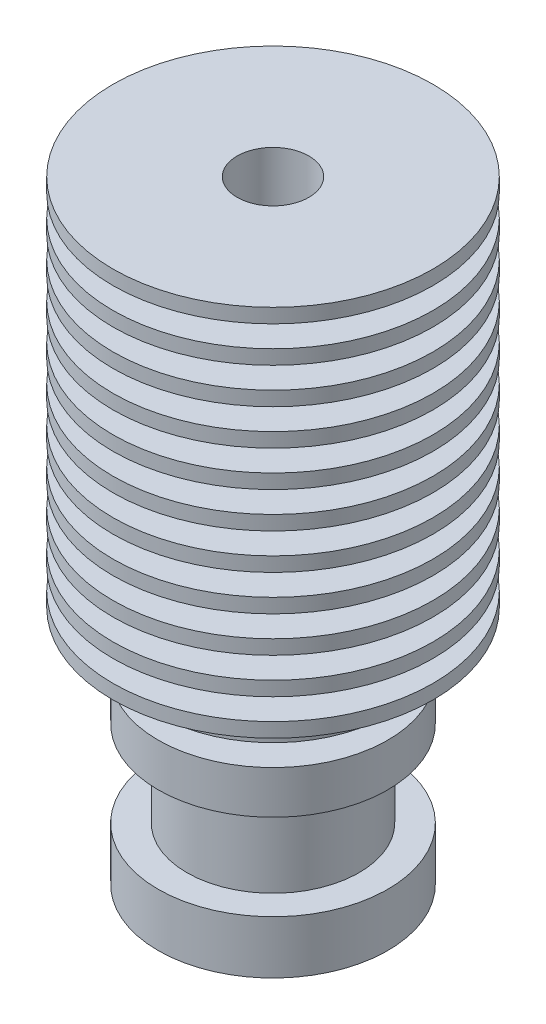
ISO-10303-21;
HEADER;
FILE_DESCRIPTION(('STEP AP214'),'2;1');
FILE_NAME('part.step','',(''),(''),'','','');
FILE_SCHEMA(('AUTOMOTIVE_DESIGN { 1 0 10303 214 1 1 1 1 }'));
ENDSEC;
DATA;
#1=APPLICATION_CONTEXT('core data for automotive mechanical design processes');
#2=APPLICATION_PROTOCOL_DEFINITION('international standard','automotive_design',2000,#1);
#3=PRODUCT_CONTEXT('',#1,'mechanical');
#4=PRODUCT('Part','Part','',(#3));
#5=PRODUCT_RELATED_PRODUCT_CATEGORY('part','',(#4));
#6=PRODUCT_DEFINITION_FORMATION('','',#4);
#7=PRODUCT_DEFINITION_CONTEXT('part definition',#1,'design');
#8=PRODUCT_DEFINITION('design','',#6,#7);
#9=PRODUCT_DEFINITION_SHAPE('','',#8);
#10=(LENGTH_UNIT() NAMED_UNIT(*) SI_UNIT(.MILLI.,.METRE.));
#11=(NAMED_UNIT(*) PLANE_ANGLE_UNIT() SI_UNIT($,.RADIAN.));
#12=(NAMED_UNIT(*) SI_UNIT($,.STERADIAN.) SOLID_ANGLE_UNIT());
#13=UNCERTAINTY_MEASURE_WITH_UNIT(LENGTH_MEASURE(1.E-05),#10,'distance_accuracy_value','');
#14=(GEOMETRIC_REPRESENTATION_CONTEXT(3) GLOBAL_UNCERTAINTY_ASSIGNED_CONTEXT((#13)) GLOBAL_UNIT_ASSIGNED_CONTEXT((#10,
#11,#12)) REPRESENTATION_CONTEXT('',''));
#15=CARTESIAN_POINT('',(0.,0.,0.));
#16=DIRECTION('',(0.,0.,1.));
#17=DIRECTION('',(1.,0.,0.));
#18=AXIS2_PLACEMENT_3D('',#15,#16,#17);
#19=CARTESIAN_POINT('',(0.,12.7,0.));
#20=DIRECTION('',(0.,1.,0.));
#21=DIRECTION('',(0.,0.,1.));
#22=AXIS2_PLACEMENT_3D('',#19,#20,#21);
#23=CONICAL_SURFACE('',#22,4.5,0.05235987755983);
#24=CARTESIAN_POINT('',(0.,40.2,0.));
#25=DIRECTION('',(0.,1.,0.));
#26=DIRECTION('',(0.,0.,1.));
#27=AXIS2_PLACEMENT_3D('',#24,#25,#26);
#28=CIRCLE('',#27,5.94121393028364);
#29=CARTESIAN_POINT('',(0.,40.2,5.94121393028364));
#30=VERTEX_POINT('',#29);
#31=EDGE_CURVE('E49',#30,#30,#28,.T.);
#32=ORIENTED_EDGE('',*,*,#31,.T.);
#33=EDGE_LOOP('',(#32));
#34=FACE_BOUND('',#33,.T.);
#35=CARTESIAN_POINT('',(0.,41.7,0.));
#36=DIRECTION('',(0.,1.,0.));
#37=DIRECTION('',(0.,0.,1.));
#38=AXIS2_PLACEMENT_3D('',#35,#36,#37);
#39=CIRCLE('',#38,6.0198255992082);
#40=CARTESIAN_POINT('',(0.,41.7,6.0198255992082));
#41=VERTEX_POINT('',#40);
#42=EDGE_CURVE('E10',#41,#41,#39,.T.);
#43=ORIENTED_EDGE('',*,*,#42,.F.);
#44=EDGE_LOOP('',(#43));
#45=FACE_BOUND('',#44,.T.);
#46=ADVANCED_FACE('F34',(#34,#45),#23,.T.);
#47=CARTESIAN_POINT('',(0.,37.7,0.));
#48=DIRECTION('',(0.,1.,0.));
#49=DIRECTION('',(0.,0.,1.));
#50=AXIS2_PLACEMENT_3D('',#47,#48,#49);
#51=CIRCLE('',#50,5.81019448207603);
#52=CARTESIAN_POINT('',(0.,37.7,5.81019448207603));
#53=VERTEX_POINT('',#52);
#54=EDGE_CURVE('E54',#53,#53,#51,.T.);
#55=ORIENTED_EDGE('',*,*,#54,.T.);
#56=EDGE_LOOP('',(#55));
#57=FACE_BOUND('',#56,.T.);
#58=CARTESIAN_POINT('',(0.,39.2,0.));
#59=DIRECTION('',(0.,1.,0.));
#60=DIRECTION('',(0.,0.,1.));
#61=AXIS2_PLACEMENT_3D('',#58,#59,#60);
#62=CIRCLE('',#61,5.88880615100059);
#63=CARTESIAN_POINT('',(0.,39.2,5.88880615100059));
#64=VERTEX_POINT('',#63);
#65=EDGE_CURVE('E42',#64,#64,#62,.T.);
#66=ORIENTED_EDGE('',*,*,#65,.F.);
#67=EDGE_LOOP('',(#66));
#68=FACE_BOUND('',#67,.T.);
#69=ADVANCED_FACE('F252',(#57,#68),#23,.T.);
#70=CARTESIAN_POINT('',(0.,35.2,0.));
#71=DIRECTION('',(0.,1.,0.));
#72=DIRECTION('',(0.,0.,1.));
#73=AXIS2_PLACEMENT_3D('',#70,#71,#72);
#74=CIRCLE('',#73,5.67917503386843);
#75=CARTESIAN_POINT('',(0.,35.2,5.67917503386843));
#76=VERTEX_POINT('',#75);
#77=EDGE_CURVE('E62',#76,#76,#74,.T.);
#78=ORIENTED_EDGE('',*,*,#77,.T.);
#79=EDGE_LOOP('',(#78));
#80=FACE_BOUND('',#79,.T.);
#81=CARTESIAN_POINT('',(0.,36.7,0.));
#82=DIRECTION('',(0.,1.,0.));
#83=DIRECTION('',(0.,0.,1.));
#84=AXIS2_PLACEMENT_3D('',#81,#82,#83);
#85=CIRCLE('',#84,5.75778670279299);
#86=CARTESIAN_POINT('',(0.,36.7,5.75778670279299));
#87=VERTEX_POINT('',#86);
#88=EDGE_CURVE('E46',#87,#87,#85,.T.);
#89=ORIENTED_EDGE('',*,*,#88,.F.);
#90=EDGE_LOOP('',(#89));
#91=FACE_BOUND('',#90,.T.);
#92=ADVANCED_FACE('F258',(#80,#91),#23,.T.);
#93=CARTESIAN_POINT('',(0.,32.7,0.));
#94=DIRECTION('',(0.,1.,0.));
#95=DIRECTION('',(0.,0.,1.));
#96=AXIS2_PLACEMENT_3D('',#93,#94,#95);
#97=CIRCLE('',#96,5.54815558566083);
#98=CARTESIAN_POINT('',(0.,32.7,5.54815558566083));
#99=VERTEX_POINT('',#98);
#100=EDGE_CURVE('E70',#99,#99,#97,.T.);
#101=ORIENTED_EDGE('',*,*,#100,.T.);
#102=EDGE_LOOP('',(#101));
#103=FACE_BOUND('',#102,.T.);
#104=CARTESIAN_POINT('',(0.,34.2,0.));
#105=DIRECTION('',(0.,1.,0.));
#106=DIRECTION('',(0.,0.,1.));
#107=AXIS2_PLACEMENT_3D('',#104,#105,#106);
#108=CIRCLE('',#107,5.62676725458539);
#109=CARTESIAN_POINT('',(0.,34.2,5.62676725458539));
#110=VERTEX_POINT('',#109);
#111=EDGE_CURVE('E61',#110,#110,#108,.T.);
#112=ORIENTED_EDGE('',*,*,#111,.F.);
#113=EDGE_LOOP('',(#112));
#114=FACE_BOUND('',#113,.T.);
#115=ADVANCED_FACE('F496',(#103,#114),#23,.T.);
#116=CARTESIAN_POINT('',(0.,30.2,0.));
#117=DIRECTION('',(0.,1.,0.));
#118=DIRECTION('',(0.,0.,1.));
#119=AXIS2_PLACEMENT_3D('',#116,#117,#118);
#120=CIRCLE('',#119,5.41713613745322);
#121=CARTESIAN_POINT('',(0.,30.2,5.41713613745322));
#122=VERTEX_POINT('',#121);
#123=EDGE_CURVE('E78',#122,#122,#120,.T.);
#124=ORIENTED_EDGE('',*,*,#123,.T.);
#125=EDGE_LOOP('',(#124));
#126=FACE_BOUND('',#125,.T.);
#127=CARTESIAN_POINT('',(0.,31.7,0.));
#128=DIRECTION('',(0.,1.,0.));
#129=DIRECTION('',(0.,0.,1.));
#130=AXIS2_PLACEMENT_3D('',#127,#128,#129);
#131=CIRCLE('',#130,5.49574780637779);
#132=CARTESIAN_POINT('',(0.,31.7,5.49574780637779));
#133=VERTEX_POINT('',#132);
#134=EDGE_CURVE('E69',#133,#133,#131,.T.);
#135=ORIENTED_EDGE('',*,*,#134,.F.);
#136=EDGE_LOOP('',(#135));
#137=FACE_BOUND('',#136,.T.);
#138=ADVANCED_FACE('F486',(#126,#137),#23,.T.);
#139=CARTESIAN_POINT('',(0.,27.7,0.));
#140=DIRECTION('',(0.,1.,0.));
#141=DIRECTION('',(0.,0.,1.));
#142=AXIS2_PLACEMENT_3D('',#139,#140,#141);
#143=CIRCLE('',#142,5.28611668924562);
#144=CARTESIAN_POINT('',(0.,27.7,5.28611668924562));
#145=VERTEX_POINT('',#144);
#146=EDGE_CURVE('E86',#145,#145,#143,.T.);
#147=ORIENTED_EDGE('',*,*,#146,.T.);
#148=EDGE_LOOP('',(#147));
#149=FACE_BOUND('',#148,.T.);
#150=CARTESIAN_POINT('',(0.,29.2,0.));
#151=DIRECTION('',(0.,1.,0.));
#152=DIRECTION('',(0.,0.,1.));
#153=AXIS2_PLACEMENT_3D('',#150,#151,#152);
#154=CIRCLE('',#153,5.36472835817018);
#155=CARTESIAN_POINT('',(0.,29.2,5.36472835817018));
#156=VERTEX_POINT('',#155);
#157=EDGE_CURVE('E77',#156,#156,#154,.T.);
#158=ORIENTED_EDGE('',*,*,#157,.F.);
#159=EDGE_LOOP('',(#158));
#160=FACE_BOUND('',#159,.T.);
#161=ADVANCED_FACE('F476',(#149,#160),#23,.T.);
#162=CARTESIAN_POINT('',(0.,25.2,0.));
#163=DIRECTION('',(0.,1.,0.));
#164=DIRECTION('',(0.,0.,1.));
#165=AXIS2_PLACEMENT_3D('',#162,#163,#164);
#166=CIRCLE('',#165,5.15509724103802);
#167=CARTESIAN_POINT('',(0.,25.2,5.15509724103802));
#168=VERTEX_POINT('',#167);
#169=EDGE_CURVE('E94',#168,#168,#166,.T.);
#170=ORIENTED_EDGE('',*,*,#169,.T.);
#171=EDGE_LOOP('',(#170));
#172=FACE_BOUND('',#171,.T.);
#173=CARTESIAN_POINT('',(0.,26.7,0.));
#174=DIRECTION('',(0.,1.,0.));
#175=DIRECTION('',(0.,0.,1.));
#176=AXIS2_PLACEMENT_3D('',#173,#174,#175);
#177=CIRCLE('',#176,5.23370890996258);
#178=CARTESIAN_POINT('',(0.,26.7,5.23370890996258));
#179=VERTEX_POINT('',#178);
#180=EDGE_CURVE('E85',#179,#179,#177,.T.);
#181=ORIENTED_EDGE('',*,*,#180,.F.);
#182=EDGE_LOOP('',(#181));
#183=FACE_BOUND('',#182,.T.);
#184=ADVANCED_FACE('F471',(#172,#183),#23,.T.);
#185=CARTESIAN_POINT('',(0.,22.7,0.));
#186=DIRECTION('',(0.,1.,0.));
#187=DIRECTION('',(0.,0.,1.));
#188=AXIS2_PLACEMENT_3D('',#185,#186,#187);
#189=CIRCLE('',#188,5.02407779283041);
#190=CARTESIAN_POINT('',(0.,22.7,5.02407779283041));
#191=VERTEX_POINT('',#190);
#192=EDGE_CURVE('E102',#191,#191,#189,.T.);
#193=ORIENTED_EDGE('',*,*,#192,.T.);
#194=EDGE_LOOP('',(#193));
#195=FACE_BOUND('',#194,.T.);
#196=CARTESIAN_POINT('',(0.,24.2,0.));
#197=DIRECTION('',(0.,1.,0.));
#198=DIRECTION('',(0.,0.,1.));
#199=AXIS2_PLACEMENT_3D('',#196,#197,#198);
#200=CIRCLE('',#199,5.10268946175498);
#201=CARTESIAN_POINT('',(0.,24.2,5.10268946175498));
#202=VERTEX_POINT('',#201);
#203=EDGE_CURVE('E93',#202,#202,#200,.T.);
#204=ORIENTED_EDGE('',*,*,#203,.F.);
#205=EDGE_LOOP('',(#204));
#206=FACE_BOUND('',#205,.T.);
#207=ADVANCED_FACE('F465',(#195,#206),#23,.T.);
#208=CARTESIAN_POINT('',(0.,20.2,0.));
#209=DIRECTION('',(0.,1.,0.));
#210=DIRECTION('',(0.,0.,1.));
#211=AXIS2_PLACEMENT_3D('',#208,#209,#210);
#212=CIRCLE('',#211,4.89305834462281);
#213=CARTESIAN_POINT('',(0.,20.2,4.89305834462281));
#214=VERTEX_POINT('',#213);
#215=EDGE_CURVE('E110',#214,#214,#212,.T.);
#216=ORIENTED_EDGE('',*,*,#215,.T.);
#217=EDGE_LOOP('',(#216));
#218=FACE_BOUND('',#217,.T.);
#219=CARTESIAN_POINT('',(0.,21.7,0.));
#220=DIRECTION('',(0.,1.,0.));
#221=DIRECTION('',(0.,0.,1.));
#222=AXIS2_PLACEMENT_3D('',#219,#220,#221);
#223=CIRCLE('',#222,4.97167001354737);
#224=CARTESIAN_POINT('',(0.,21.7,4.97167001354737));
#225=VERTEX_POINT('',#224);
#226=EDGE_CURVE('E101',#225,#225,#223,.T.);
#227=ORIENTED_EDGE('',*,*,#226,.F.);
#228=EDGE_LOOP('',(#227));
#229=FACE_BOUND('',#228,.T.);
#230=ADVANCED_FACE('F287',(#218,#229),#23,.T.);
#231=CARTESIAN_POINT('',(0.,17.7,0.));
#232=DIRECTION('',(0.,1.,0.));
#233=DIRECTION('',(0.,0.,1.));
#234=AXIS2_PLACEMENT_3D('',#231,#232,#233);
#235=CIRCLE('',#234,4.76203889641521);
#236=CARTESIAN_POINT('',(0.,17.7,4.76203889641521));
#237=VERTEX_POINT('',#236);
#238=EDGE_CURVE('E118',#237,#237,#235,.T.);
#239=ORIENTED_EDGE('',*,*,#238,.T.);
#240=EDGE_LOOP('',(#239));
#241=FACE_BOUND('',#240,.T.);
#242=CARTESIAN_POINT('',(0.,19.2,0.));
#243=DIRECTION('',(0.,1.,0.));
#244=DIRECTION('',(0.,0.,1.));
#245=AXIS2_PLACEMENT_3D('',#242,#243,#244);
#246=CIRCLE('',#245,4.84065056533977);
#247=CARTESIAN_POINT('',(0.,19.2,4.84065056533977));
#248=VERTEX_POINT('',#247);
#249=EDGE_CURVE('E109',#248,#248,#246,.T.);
#250=ORIENTED_EDGE('',*,*,#249,.F.);
#251=EDGE_LOOP('',(#250));
#252=FACE_BOUND('',#251,.T.);
#253=ADVANCED_FACE('F278',(#241,#252),#23,.T.);
#254=CARTESIAN_POINT('',(0.,15.2,0.));
#255=DIRECTION('',(0.,1.,0.));
#256=DIRECTION('',(0.,0.,1.));
#257=AXIS2_PLACEMENT_3D('',#254,#255,#256);
#258=CIRCLE('',#257,4.6310194482076);
#259=CARTESIAN_POINT('',(0.,15.2,4.6310194482076));
#260=VERTEX_POINT('',#259);
#261=EDGE_CURVE('E126',#260,#260,#258,.T.);
#262=ORIENTED_EDGE('',*,*,#261,.T.);
#263=EDGE_LOOP('',(#262));
#264=FACE_BOUND('',#263,.T.);
#265=CARTESIAN_POINT('',(0.,16.7,0.));
#266=DIRECTION('',(0.,1.,0.));
#267=DIRECTION('',(0.,0.,1.));
#268=AXIS2_PLACEMENT_3D('',#265,#266,#267);
#269=CIRCLE('',#268,4.70963111713217);
#270=CARTESIAN_POINT('',(0.,16.7,4.70963111713217));
#271=VERTEX_POINT('',#270);
#272=EDGE_CURVE('E117',#271,#271,#269,.T.);
#273=ORIENTED_EDGE('',*,*,#272,.F.);
#274=EDGE_LOOP('',(#273));
#275=FACE_BOUND('',#274,.T.);
#276=ADVANCED_FACE('F265',(#264,#275),#23,.T.);
#277=CARTESIAN_POINT('',(0.,15.2,0.));
#278=DIRECTION('',(0.,1.,0.));
#279=DIRECTION('',(0.,0.,1.));
#280=AXIS2_PLACEMENT_3D('',#277,#278,#279);
#281=PLANE('',#280);
#282=CARTESIAN_POINT('',(0.,15.2,0.));
#283=DIRECTION('',(0.,1.,0.));
#284=DIRECTION('',(0.,0.,1.));
#285=AXIS2_PLACEMENT_3D('',#282,#283,#284);
#286=CIRCLE('',#285,8.);
#287=CARTESIAN_POINT('',(0.,15.2,8.));
#288=VERTEX_POINT('',#287);
#289=EDGE_CURVE('E130',#288,#288,#286,.T.);
#290=ORIENTED_EDGE('',*,*,#289,.T.);
#291=EDGE_LOOP('',(#290));
#292=FACE_BOUND('',#291,.T.);
#293=ORIENTED_EDGE('',*,*,#261,.F.);
#294=EDGE_LOOP('',(#293));
#295=FACE_BOUND('',#294,.T.);
#296=ADVANCED_FACE('F277',(#292,#295),#281,.T.);
#297=CARTESIAN_POINT('',(0.,14.2,0.));
#298=DIRECTION('',(0.,1.,0.));
#299=DIRECTION('',(0.,0.,1.));
#300=AXIS2_PLACEMENT_3D('',#297,#298,#299);
#301=PLANE('',#300);
#302=CARTESIAN_POINT('',(0.,14.2,0.));
#303=DIRECTION('',(0.,1.,0.));
#304=DIRECTION('',(0.,0.,1.));
#305=AXIS2_PLACEMENT_3D('',#302,#303,#304);
#306=CIRCLE('',#305,8.);
#307=CARTESIAN_POINT('',(0.,14.2,8.));
#308=VERTEX_POINT('',#307);
#309=EDGE_CURVE('E121',#308,#308,#306,.T.);
#310=ORIENTED_EDGE('',*,*,#309,.F.);
#311=EDGE_LOOP('',(#310));
#312=FACE_BOUND('',#311,.T.);
#313=CARTESIAN_POINT('',(0.,14.2,0.));
#314=DIRECTION('',(0.,1.,0.));
#315=DIRECTION('',(0.,0.,1.));
#316=AXIS2_PLACEMENT_3D('',#313,#314,#315);
#317=CIRCLE('',#316,4.57861166892456);
#318=CARTESIAN_POINT('',(0.,14.2,4.57861166892456));
#319=VERTEX_POINT('',#318);
#320=EDGE_CURVE('E125',#319,#319,#317,.T.);
#321=ORIENTED_EDGE('',*,*,#320,.T.);
#322=EDGE_LOOP('',(#321));
#323=FACE_BOUND('',#322,.T.);
#324=ADVANCED_FACE('F284',(#312,#323),#301,.F.);
#325=CARTESIAN_POINT('',(0.,15.2,0.));
#326=DIRECTION('',(0.,-1.,0.));
#327=DIRECTION('',(0.,0.,-1.));
#328=AXIS2_PLACEMENT_3D('',#325,#326,#327);
#329=CYLINDRICAL_SURFACE('',#328,8.);
#330=ORIENTED_EDGE('',*,*,#289,.F.);
#331=EDGE_LOOP('',(#330));
#332=FACE_BOUND('',#331,.T.);
#333=ORIENTED_EDGE('',*,*,#309,.T.);
#334=EDGE_LOOP('',(#333));
#335=FACE_BOUND('',#334,.T.);
#336=ADVANCED_FACE('F308',(#332,#335),#329,.T.);
#337=CARTESIAN_POINT('',(0.,0.,0.));
#338=DIRECTION('',(0.,1.,0.));
#339=DIRECTION('',(0.,0.,1.));
#340=AXIS2_PLACEMENT_3D('',#337,#338,#339);
#341=PLANE('',#340);
#342=CARTESIAN_POINT('',(0.,0.,0.));
#343=DIRECTION('',(0.,-1.,0.));
#344=DIRECTION('',(0.,0.,-1.));
#345=AXIS2_PLACEMENT_3D('',#342,#343,#344);
#346=CIRCLE('',#345,2.1);
#347=CARTESIAN_POINT('',(0.,0.,-2.1));
#348=VERTEX_POINT('',#347);
#349=EDGE_CURVE('E222',#348,#348,#346,.T.);
#350=ORIENTED_EDGE('',*,*,#349,.F.);
#351=EDGE_LOOP('',(#350));
#352=FACE_BOUND('',#351,.T.);
#353=CARTESIAN_POINT('',(0.,0.,0.));
#354=DIRECTION('',(0.,1.,0.));
#355=DIRECTION('',(0.,0.,1.));
#356=AXIS2_PLACEMENT_3D('',#353,#354,#355);
#357=CIRCLE('',#356,8.);
#358=CARTESIAN_POINT('',(0.,0.,8.));
#359=VERTEX_POINT('',#358);
#360=EDGE_CURVE('E142',#359,#359,#357,.T.);
#361=ORIENTED_EDGE('',*,*,#360,.F.);
#362=EDGE_LOOP('',(#361));
#363=FACE_BOUND('',#362,.T.);
#364=ADVANCED_FACE('F312',(#352,#363),#341,.F.);
#365=CARTESIAN_POINT('',(0.,3.7,0.));
#366=DIRECTION('',(0.,-1.,0.));
#367=DIRECTION('',(0.,0.,-1.));
#368=AXIS2_PLACEMENT_3D('',#365,#366,#367);
#369=CYLINDRICAL_SURFACE('',#368,8.);
#370=CARTESIAN_POINT('',(0.,3.7,0.));
#371=DIRECTION('',(0.,1.,0.));
#372=DIRECTION('',(0.,0.,1.));
#373=AXIS2_PLACEMENT_3D('',#370,#371,#372);
#374=CIRCLE('',#373,8.);
#375=CARTESIAN_POINT('',(0.,3.7,8.));
#376=VERTEX_POINT('',#375);
#377=EDGE_CURVE('E141',#376,#376,#374,.T.);
#378=ORIENTED_EDGE('',*,*,#377,.F.);
#379=EDGE_LOOP('',(#378));
#380=FACE_BOUND('',#379,.T.);
#381=ORIENTED_EDGE('',*,*,#360,.T.);
#382=EDGE_LOOP('',(#381));
#383=FACE_BOUND('',#382,.T.);
#384=ADVANCED_FACE('F36',(#380,#383),#369,.T.);
#385=CARTESIAN_POINT('',(0.,3.7,0.));
#386=DIRECTION('',(0.,1.,0.));
#387=DIRECTION('',(0.,0.,1.));
#388=AXIS2_PLACEMENT_3D('',#385,#386,#387);
#389=PLANE('',#388);
#390=ORIENTED_EDGE('',*,*,#377,.T.);
#391=EDGE_LOOP('',(#390));
#392=FACE_BOUND('',#391,.T.);
#393=CARTESIAN_POINT('',(0.,3.7,0.));
#394=DIRECTION('',(0.,1.,0.));
#395=DIRECTION('',(0.,0.,1.));
#396=AXIS2_PLACEMENT_3D('',#393,#394,#395);
#397=CIRCLE('',#396,6.);
#398=CARTESIAN_POINT('',(0.,3.7,6.));
#399=VERTEX_POINT('',#398);
#400=EDGE_CURVE('E148',#399,#399,#397,.T.);
#401=ORIENTED_EDGE('',*,*,#400,.F.);
#402=EDGE_LOOP('',(#401));
#403=FACE_BOUND('',#402,.T.);
#404=ADVANCED_FACE('F649',(#392,#403),#389,.T.);
#405=CARTESIAN_POINT('',(0.,9.7,0.));
#406=DIRECTION('',(0.,-1.,0.));
#407=DIRECTION('',(0.,0.,-1.));
#408=AXIS2_PLACEMENT_3D('',#405,#406,#407);
#409=CYLINDRICAL_SURFACE('',#408,6.);
#410=CARTESIAN_POINT('',(0.,9.7,0.));
#411=DIRECTION('',(0.,1.,0.));
#412=DIRECTION('',(0.,0.,1.));
#413=AXIS2_PLACEMENT_3D('',#410,#411,#412);
#414=CIRCLE('',#413,6.);
#415=CARTESIAN_POINT('',(0.,9.7,6.));
#416=VERTEX_POINT('',#415);
#417=EDGE_CURVE('E145',#416,#416,#414,.T.);
#418=ORIENTED_EDGE('',*,*,#417,.F.);
#419=EDGE_LOOP('',(#418));
#420=FACE_BOUND('',#419,.T.);
#421=ORIENTED_EDGE('',*,*,#400,.T.);
#422=EDGE_LOOP('',(#421));
#423=FACE_BOUND('',#422,.T.);
#424=ADVANCED_FACE('F638',(#420,#423),#409,.T.);
#425=CARTESIAN_POINT('',(0.,9.7,0.));
#426=DIRECTION('',(0.,1.,0.));
#427=DIRECTION('',(0.,0.,1.));
#428=AXIS2_PLACEMENT_3D('',#425,#426,#427);
#429=PLANE('',#428);
#430=CARTESIAN_POINT('',(0.,9.7,0.));
#431=DIRECTION('',(0.,1.,0.));
#432=DIRECTION('',(0.,0.,1.));
#433=AXIS2_PLACEMENT_3D('',#430,#431,#432);
#434=CIRCLE('',#433,8.);
#435=CARTESIAN_POINT('',(0.,9.7,8.));
#436=VERTEX_POINT('',#435);
#437=EDGE_CURVE('E154',#436,#436,#434,.T.);
#438=ORIENTED_EDGE('',*,*,#437,.F.);
#439=EDGE_LOOP('',(#438));
#440=FACE_BOUND('',#439,.T.);
#441=ORIENTED_EDGE('',*,*,#417,.T.);
#442=EDGE_LOOP('',(#441));
#443=FACE_BOUND('',#442,.T.);
#444=ADVANCED_FACE('F628',(#440,#443),#429,.F.);
#445=CARTESIAN_POINT('',(0.,12.7,0.));
#446=DIRECTION('',(0.,-1.,0.));
#447=DIRECTION('',(0.,0.,-1.));
#448=AXIS2_PLACEMENT_3D('',#445,#446,#447);
#449=CYLINDRICAL_SURFACE('',#448,8.);
#450=CARTESIAN_POINT('',(0.,12.7,0.));
#451=DIRECTION('',(0.,1.,0.));
#452=DIRECTION('',(0.,0.,1.));
#453=AXIS2_PLACEMENT_3D('',#450,#451,#452);
#454=CIRCLE('',#453,8.);
#455=CARTESIAN_POINT('',(0.,12.7,8.));
#456=VERTEX_POINT('',#455);
#457=EDGE_CURVE('E151',#456,#456,#454,.T.);
#458=ORIENTED_EDGE('',*,*,#457,.F.);
#459=EDGE_LOOP('',(#458));
#460=FACE_BOUND('',#459,.T.);
#461=ORIENTED_EDGE('',*,*,#437,.T.);
#462=EDGE_LOOP('',(#461));
#463=FACE_BOUND('',#462,.T.);
#464=ADVANCED_FACE('F273',(#460,#463),#449,.T.);
#465=CARTESIAN_POINT('',(0.,12.7,0.));
#466=DIRECTION('',(0.,1.,0.));
#467=DIRECTION('',(0.,0.,1.));
#468=AXIS2_PLACEMENT_3D('',#465,#466,#467);
#469=PLANE('',#468);
#470=ORIENTED_EDGE('',*,*,#457,.T.);
#471=EDGE_LOOP('',(#470));
#472=FACE_BOUND('',#471,.T.);
#473=CARTESIAN_POINT('',(0.,12.7,0.));
#474=DIRECTION('',(0.,1.,0.));
#475=DIRECTION('',(0.,0.,1.));
#476=AXIS2_PLACEMENT_3D('',#473,#474,#475);
#477=CIRCLE('',#476,4.5);
#478=CARTESIAN_POINT('',(0.,12.7,4.5));
#479=VERTEX_POINT('',#478);
#480=EDGE_CURVE('E162',#479,#479,#477,.T.);
#481=ORIENTED_EDGE('',*,*,#480,.F.);
#482=EDGE_LOOP('',(#481));
#483=FACE_BOUND('',#482,.T.);
#484=ADVANCED_FACE('F263',(#472,#483),#469,.T.);
#485=ORIENTED_EDGE('',*,*,#480,.T.);
#486=EDGE_LOOP('',(#485));
#487=FACE_BOUND('',#486,.T.);
#488=ORIENTED_EDGE('',*,*,#320,.F.);
#489=EDGE_LOOP('',(#488));
#490=FACE_BOUND('',#489,.T.);
#491=ADVANCED_FACE('F254',(#487,#490),#23,.T.);
#492=CARTESIAN_POINT('',(0.,17.7,0.));
#493=DIRECTION('',(0.,1.,0.));
#494=DIRECTION('',(0.,0.,1.));
#495=AXIS2_PLACEMENT_3D('',#492,#493,#494);
#496=PLANE('',#495);
#497=CARTESIAN_POINT('',(0.,17.7,0.));
#498=DIRECTION('',(0.,1.,0.));
#499=DIRECTION('',(0.,0.,1.));
#500=AXIS2_PLACEMENT_3D('',#497,#498,#499);
#501=CIRCLE('',#500,11.15);
#502=CARTESIAN_POINT('',(0.,17.7,11.15));
#503=VERTEX_POINT('',#502);
#504=EDGE_CURVE('E122',#503,#503,#501,.T.);
#505=ORIENTED_EDGE('',*,*,#504,.T.);
#506=EDGE_LOOP('',(#505));
#507=FACE_BOUND('',#506,.T.);
#508=ORIENTED_EDGE('',*,*,#238,.F.);
#509=EDGE_LOOP('',(#508));
#510=FACE_BOUND('',#509,.T.);
#511=ADVANCED_FACE('F262',(#507,#510),#496,.T.);
#512=CARTESIAN_POINT('',(0.,16.7,0.));
#513=DIRECTION('',(0.,1.,0.));
#514=DIRECTION('',(0.,0.,1.));
#515=AXIS2_PLACEMENT_3D('',#512,#513,#514);
#516=PLANE('',#515);
#517=CARTESIAN_POINT('',(0.,16.7,0.));
#518=DIRECTION('',(0.,1.,0.));
#519=DIRECTION('',(0.,0.,1.));
#520=AXIS2_PLACEMENT_3D('',#517,#518,#519);
#521=CIRCLE('',#520,11.15);
#522=CARTESIAN_POINT('',(0.,16.7,11.15));
#523=VERTEX_POINT('',#522);
#524=EDGE_CURVE('E113',#523,#523,#521,.T.);
#525=ORIENTED_EDGE('',*,*,#524,.F.);
#526=EDGE_LOOP('',(#525));
#527=FACE_BOUND('',#526,.T.);
#528=ORIENTED_EDGE('',*,*,#272,.T.);
#529=EDGE_LOOP('',(#528));
#530=FACE_BOUND('',#529,.T.);
#531=ADVANCED_FACE('F270',(#527,#530),#516,.F.);
#532=CARTESIAN_POINT('',(0.,17.7,0.));
#533=DIRECTION('',(0.,-1.,0.));
#534=DIRECTION('',(0.,0.,-1.));
#535=AXIS2_PLACEMENT_3D('',#532,#533,#534);
#536=CYLINDRICAL_SURFACE('',#535,11.15);
#537=ORIENTED_EDGE('',*,*,#504,.F.);
#538=EDGE_LOOP('',(#537));
#539=FACE_BOUND('',#538,.T.);
#540=ORIENTED_EDGE('',*,*,#524,.T.);
#541=EDGE_LOOP('',(#540));
#542=FACE_BOUND('',#541,.T.);
#543=ADVANCED_FACE('F294',(#539,#542),#536,.T.);
#544=CARTESIAN_POINT('',(0.,20.2,0.));
#545=DIRECTION('',(0.,1.,0.));
#546=DIRECTION('',(0.,0.,1.));
#547=AXIS2_PLACEMENT_3D('',#544,#545,#546);
#548=PLANE('',#547);
#549=CARTESIAN_POINT('',(0.,20.2,0.));
#550=DIRECTION('',(0.,1.,0.));
#551=DIRECTION('',(0.,0.,1.));
#552=AXIS2_PLACEMENT_3D('',#549,#550,#551);
#553=CIRCLE('',#552,11.15);
#554=CARTESIAN_POINT('',(0.,20.2,11.15));
#555=VERTEX_POINT('',#554);
#556=EDGE_CURVE('E114',#555,#555,#553,.T.);
#557=ORIENTED_EDGE('',*,*,#556,.T.);
#558=EDGE_LOOP('',(#557));
#559=FACE_BOUND('',#558,.T.);
#560=ORIENTED_EDGE('',*,*,#215,.F.);
#561=EDGE_LOOP('',(#560));
#562=FACE_BOUND('',#561,.T.);
#563=ADVANCED_FACE('F300',(#559,#562),#548,.T.);
#564=CARTESIAN_POINT('',(0.,19.2,0.));
#565=DIRECTION('',(0.,1.,0.));
#566=DIRECTION('',(0.,0.,1.));
#567=AXIS2_PLACEMENT_3D('',#564,#565,#566);
#568=PLANE('',#567);
#569=CARTESIAN_POINT('',(0.,19.2,0.));
#570=DIRECTION('',(0.,1.,0.));
#571=DIRECTION('',(0.,0.,1.));
#572=AXIS2_PLACEMENT_3D('',#569,#570,#571);
#573=CIRCLE('',#572,11.15);
#574=CARTESIAN_POINT('',(0.,19.2,11.15));
#575=VERTEX_POINT('',#574);
#576=EDGE_CURVE('E105',#575,#575,#573,.T.);
#577=ORIENTED_EDGE('',*,*,#576,.F.);
#578=EDGE_LOOP('',(#577));
#579=FACE_BOUND('',#578,.T.);
#580=ORIENTED_EDGE('',*,*,#249,.T.);
#581=EDGE_LOOP('',(#580));
#582=FACE_BOUND('',#581,.T.);
#583=ADVANCED_FACE('F446',(#579,#582),#568,.F.);
#584=CARTESIAN_POINT('',(0.,20.2,0.));
#585=DIRECTION('',(0.,-1.,0.));
#586=DIRECTION('',(0.,0.,-1.));
#587=AXIS2_PLACEMENT_3D('',#584,#585,#586);
#588=CYLINDRICAL_SURFACE('',#587,11.15);
#589=ORIENTED_EDGE('',*,*,#556,.F.);
#590=EDGE_LOOP('',(#589));
#591=FACE_BOUND('',#590,.T.);
#592=ORIENTED_EDGE('',*,*,#576,.T.);
#593=EDGE_LOOP('',(#592));
#594=FACE_BOUND('',#593,.T.);
#595=ADVANCED_FACE('F436',(#591,#594),#588,.T.);
#596=CARTESIAN_POINT('',(0.,22.7,0.));
#597=DIRECTION('',(0.,1.,0.));
#598=DIRECTION('',(0.,0.,1.));
#599=AXIS2_PLACEMENT_3D('',#596,#597,#598);
#600=PLANE('',#599);
#601=CARTESIAN_POINT('',(0.,22.7,0.));
#602=DIRECTION('',(0.,1.,0.));
#603=DIRECTION('',(0.,0.,1.));
#604=AXIS2_PLACEMENT_3D('',#601,#602,#603);
#605=CIRCLE('',#604,11.15);
#606=CARTESIAN_POINT('',(0.,22.7,11.15));
#607=VERTEX_POINT('',#606);
#608=EDGE_CURVE('E106',#607,#607,#605,.T.);
#609=ORIENTED_EDGE('',*,*,#608,.T.);
#610=EDGE_LOOP('',(#609));
#611=FACE_BOUND('',#610,.T.);
#612=ORIENTED_EDGE('',*,*,#192,.F.);
#613=EDGE_LOOP('',(#612));
#614=FACE_BOUND('',#613,.T.);
#615=ADVANCED_FACE('F432',(#611,#614),#600,.T.);
#616=CARTESIAN_POINT('',(0.,21.7,0.));
#617=DIRECTION('',(0.,1.,0.));
#618=DIRECTION('',(0.,0.,1.));
#619=AXIS2_PLACEMENT_3D('',#616,#617,#618);
#620=PLANE('',#619);
#621=CARTESIAN_POINT('',(0.,21.7,0.));
#622=DIRECTION('',(0.,1.,0.));
#623=DIRECTION('',(0.,0.,1.));
#624=AXIS2_PLACEMENT_3D('',#621,#622,#623);
#625=CIRCLE('',#624,11.15);
#626=CARTESIAN_POINT('',(0.,21.7,11.15));
#627=VERTEX_POINT('',#626);
#628=EDGE_CURVE('E97',#627,#627,#625,.T.);
#629=ORIENTED_EDGE('',*,*,#628,.F.);
#630=EDGE_LOOP('',(#629));
#631=FACE_BOUND('',#630,.T.);
#632=ORIENTED_EDGE('',*,*,#226,.T.);
#633=EDGE_LOOP('',(#632));
#634=FACE_BOUND('',#633,.T.);
#635=ADVANCED_FACE('F435',(#631,#634),#620,.F.);
#636=CARTESIAN_POINT('',(0.,22.7,0.));
#637=DIRECTION('',(0.,-1.,0.));
#638=DIRECTION('',(0.,0.,-1.));
#639=AXIS2_PLACEMENT_3D('',#636,#637,#638);
#640=CYLINDRICAL_SURFACE('',#639,11.15);
#641=ORIENTED_EDGE('',*,*,#608,.F.);
#642=EDGE_LOOP('',(#641));
#643=FACE_BOUND('',#642,.T.);
#644=ORIENTED_EDGE('',*,*,#628,.T.);
#645=EDGE_LOOP('',(#644));
#646=FACE_BOUND('',#645,.T.);
#647=ADVANCED_FACE('F424',(#643,#646),#640,.T.);
#648=CARTESIAN_POINT('',(0.,25.2,0.));
#649=DIRECTION('',(0.,1.,0.));
#650=DIRECTION('',(0.,0.,1.));
#651=AXIS2_PLACEMENT_3D('',#648,#649,#650);
#652=PLANE('',#651);
#653=CARTESIAN_POINT('',(0.,25.2,0.));
#654=DIRECTION('',(0.,1.,0.));
#655=DIRECTION('',(0.,0.,1.));
#656=AXIS2_PLACEMENT_3D('',#653,#654,#655);
#657=CIRCLE('',#656,11.15);
#658=CARTESIAN_POINT('',(0.,25.2,11.15));
#659=VERTEX_POINT('',#658);
#660=EDGE_CURVE('E98',#659,#659,#657,.T.);
#661=ORIENTED_EDGE('',*,*,#660,.T.);
#662=EDGE_LOOP('',(#661));
#663=FACE_BOUND('',#662,.T.);
#664=ORIENTED_EDGE('',*,*,#169,.F.);
#665=EDGE_LOOP('',(#664));
#666=FACE_BOUND('',#665,.T.);
#667=ADVANCED_FACE('F420',(#663,#666),#652,.T.);
#668=CARTESIAN_POINT('',(0.,24.2,0.));
#669=DIRECTION('',(0.,1.,0.));
#670=DIRECTION('',(0.,0.,1.));
#671=AXIS2_PLACEMENT_3D('',#668,#669,#670);
#672=PLANE('',#671);
#673=CARTESIAN_POINT('',(0.,24.2,0.));
#674=DIRECTION('',(0.,1.,0.));
#675=DIRECTION('',(0.,0.,1.));
#676=AXIS2_PLACEMENT_3D('',#673,#674,#675);
#677=CIRCLE('',#676,11.15);
#678=CARTESIAN_POINT('',(0.,24.2,11.15));
#679=VERTEX_POINT('',#678);
#680=EDGE_CURVE('E89',#679,#679,#677,.T.);
#681=ORIENTED_EDGE('',*,*,#680,.F.);
#682=EDGE_LOOP('',(#681));
#683=FACE_BOUND('',#682,.T.);
#684=ORIENTED_EDGE('',*,*,#203,.T.);
#685=EDGE_LOOP('',(#684));
#686=FACE_BOUND('',#685,.T.);
#687=ADVANCED_FACE('F423',(#683,#686),#672,.F.);
#688=CARTESIAN_POINT('',(0.,25.2,0.));
#689=DIRECTION('',(0.,-1.,0.));
#690=DIRECTION('',(0.,0.,-1.));
#691=AXIS2_PLACEMENT_3D('',#688,#689,#690);
#692=CYLINDRICAL_SURFACE('',#691,11.15);
#693=ORIENTED_EDGE('',*,*,#660,.F.);
#694=EDGE_LOOP('',(#693));
#695=FACE_BOUND('',#694,.T.);
#696=ORIENTED_EDGE('',*,*,#680,.T.);
#697=EDGE_LOOP('',(#696));
#698=FACE_BOUND('',#697,.T.);
#699=ADVANCED_FACE('F412',(#695,#698),#692,.T.);
#700=CARTESIAN_POINT('',(0.,27.7,0.));
#701=DIRECTION('',(0.,1.,0.));
#702=DIRECTION('',(0.,0.,1.));
#703=AXIS2_PLACEMENT_3D('',#700,#701,#702);
#704=PLANE('',#703);
#705=CARTESIAN_POINT('',(0.,27.7,0.));
#706=DIRECTION('',(0.,1.,0.));
#707=DIRECTION('',(0.,0.,1.));
#708=AXIS2_PLACEMENT_3D('',#705,#706,#707);
#709=CIRCLE('',#708,11.15);
#710=CARTESIAN_POINT('',(0.,27.7,11.15));
#711=VERTEX_POINT('',#710);
#712=EDGE_CURVE('E90',#711,#711,#709,.T.);
#713=ORIENTED_EDGE('',*,*,#712,.T.);
#714=EDGE_LOOP('',(#713));
#715=FACE_BOUND('',#714,.T.);
#716=ORIENTED_EDGE('',*,*,#146,.F.);
#717=EDGE_LOOP('',(#716));
#718=FACE_BOUND('',#717,.T.);
#719=ADVANCED_FACE('F408',(#715,#718),#704,.T.);
#720=CARTESIAN_POINT('',(0.,26.7,0.));
#721=DIRECTION('',(0.,1.,0.));
#722=DIRECTION('',(0.,0.,1.));
#723=AXIS2_PLACEMENT_3D('',#720,#721,#722);
#724=PLANE('',#723);
#725=CARTESIAN_POINT('',(0.,26.7,0.));
#726=DIRECTION('',(0.,1.,0.));
#727=DIRECTION('',(0.,0.,1.));
#728=AXIS2_PLACEMENT_3D('',#725,#726,#727);
#729=CIRCLE('',#728,11.15);
#730=CARTESIAN_POINT('',(0.,26.7,11.15));
#731=VERTEX_POINT('',#730);
#732=EDGE_CURVE('E81',#731,#731,#729,.T.);
#733=ORIENTED_EDGE('',*,*,#732,.F.);
#734=EDGE_LOOP('',(#733));
#735=FACE_BOUND('',#734,.T.);
#736=ORIENTED_EDGE('',*,*,#180,.T.);
#737=EDGE_LOOP('',(#736));
#738=FACE_BOUND('',#737,.T.);
#739=ADVANCED_FACE('F411',(#735,#738),#724,.F.);
#740=CARTESIAN_POINT('',(0.,27.7,0.));
#741=DIRECTION('',(0.,-1.,0.));
#742=DIRECTION('',(0.,0.,-1.));
#743=AXIS2_PLACEMENT_3D('',#740,#741,#742);
#744=CYLINDRICAL_SURFACE('',#743,11.15);
#745=ORIENTED_EDGE('',*,*,#712,.F.);
#746=EDGE_LOOP('',(#745));
#747=FACE_BOUND('',#746,.T.);
#748=ORIENTED_EDGE('',*,*,#732,.T.);
#749=EDGE_LOOP('',(#748));
#750=FACE_BOUND('',#749,.T.);
#751=ADVANCED_FACE('F400',(#747,#750),#744,.T.);
#752=CARTESIAN_POINT('',(0.,30.2,0.));
#753=DIRECTION('',(0.,1.,0.));
#754=DIRECTION('',(0.,0.,1.));
#755=AXIS2_PLACEMENT_3D('',#752,#753,#754);
#756=PLANE('',#755);
#757=CARTESIAN_POINT('',(0.,30.2,0.));
#758=DIRECTION('',(0.,1.,0.));
#759=DIRECTION('',(0.,0.,1.));
#760=AXIS2_PLACEMENT_3D('',#757,#758,#759);
#761=CIRCLE('',#760,11.15);
#762=CARTESIAN_POINT('',(0.,30.2,11.15));
#763=VERTEX_POINT('',#762);
#764=EDGE_CURVE('E82',#763,#763,#761,.T.);
#765=ORIENTED_EDGE('',*,*,#764,.T.);
#766=EDGE_LOOP('',(#765));
#767=FACE_BOUND('',#766,.T.);
#768=ORIENTED_EDGE('',*,*,#123,.F.);
#769=EDGE_LOOP('',(#768));
#770=FACE_BOUND('',#769,.T.);
#771=ADVANCED_FACE('F396',(#767,#770),#756,.T.);
#772=CARTESIAN_POINT('',(0.,29.2,0.));
#773=DIRECTION('',(0.,1.,0.));
#774=DIRECTION('',(0.,0.,1.));
#775=AXIS2_PLACEMENT_3D('',#772,#773,#774);
#776=PLANE('',#775);
#777=CARTESIAN_POINT('',(0.,29.2,0.));
#778=DIRECTION('',(0.,1.,0.));
#779=DIRECTION('',(0.,0.,1.));
#780=AXIS2_PLACEMENT_3D('',#777,#778,#779);
#781=CIRCLE('',#780,11.15);
#782=CARTESIAN_POINT('',(0.,29.2,11.15));
#783=VERTEX_POINT('',#782);
#784=EDGE_CURVE('E73',#783,#783,#781,.T.);
#785=ORIENTED_EDGE('',*,*,#784,.F.);
#786=EDGE_LOOP('',(#785));
#787=FACE_BOUND('',#786,.T.);
#788=ORIENTED_EDGE('',*,*,#157,.T.);
#789=EDGE_LOOP('',(#788));
#790=FACE_BOUND('',#789,.T.);
#791=ADVANCED_FACE('F399',(#787,#790),#776,.F.);
#792=CARTESIAN_POINT('',(0.,30.2,0.));
#793=DIRECTION('',(0.,-1.,0.));
#794=DIRECTION('',(0.,0.,-1.));
#795=AXIS2_PLACEMENT_3D('',#792,#793,#794);
#796=CYLINDRICAL_SURFACE('',#795,11.15);
#797=ORIENTED_EDGE('',*,*,#764,.F.);
#798=EDGE_LOOP('',(#797));
#799=FACE_BOUND('',#798,.T.);
#800=ORIENTED_EDGE('',*,*,#784,.T.);
#801=EDGE_LOOP('',(#800));
#802=FACE_BOUND('',#801,.T.);
#803=ADVANCED_FACE('F388',(#799,#802),#796,.T.);
#804=CARTESIAN_POINT('',(0.,32.7,0.));
#805=DIRECTION('',(0.,1.,0.));
#806=DIRECTION('',(0.,0.,1.));
#807=AXIS2_PLACEMENT_3D('',#804,#805,#806);
#808=PLANE('',#807);
#809=CARTESIAN_POINT('',(0.,32.7,0.));
#810=DIRECTION('',(0.,1.,0.));
#811=DIRECTION('',(0.,0.,1.));
#812=AXIS2_PLACEMENT_3D('',#809,#810,#811);
#813=CIRCLE('',#812,11.15);
#814=CARTESIAN_POINT('',(0.,32.7,11.15));
#815=VERTEX_POINT('',#814);
#816=EDGE_CURVE('E74',#815,#815,#813,.T.);
#817=ORIENTED_EDGE('',*,*,#816,.T.);
#818=EDGE_LOOP('',(#817));
#819=FACE_BOUND('',#818,.T.);
#820=ORIENTED_EDGE('',*,*,#100,.F.);
#821=EDGE_LOOP('',(#820));
#822=FACE_BOUND('',#821,.T.);
#823=ADVANCED_FACE('F384',(#819,#822),#808,.T.);
#824=CARTESIAN_POINT('',(0.,31.7,0.));
#825=DIRECTION('',(0.,1.,0.));
#826=DIRECTION('',(0.,0.,1.));
#827=AXIS2_PLACEMENT_3D('',#824,#825,#826);
#828=PLANE('',#827);
#829=CARTESIAN_POINT('',(0.,31.7,0.));
#830=DIRECTION('',(0.,1.,0.));
#831=DIRECTION('',(0.,0.,1.));
#832=AXIS2_PLACEMENT_3D('',#829,#830,#831);
#833=CIRCLE('',#832,11.15);
#834=CARTESIAN_POINT('',(0.,31.7,11.15));
#835=VERTEX_POINT('',#834);
#836=EDGE_CURVE('E65',#835,#835,#833,.T.);
#837=ORIENTED_EDGE('',*,*,#836,.F.);
#838=EDGE_LOOP('',(#837));
#839=FACE_BOUND('',#838,.T.);
#840=ORIENTED_EDGE('',*,*,#134,.T.);
#841=EDGE_LOOP('',(#840));
#842=FACE_BOUND('',#841,.T.);
#843=ADVANCED_FACE('F387',(#839,#842),#828,.F.);
#844=CARTESIAN_POINT('',(0.,32.7,0.));
#845=DIRECTION('',(0.,-1.,0.));
#846=DIRECTION('',(0.,0.,-1.));
#847=AXIS2_PLACEMENT_3D('',#844,#845,#846);
#848=CYLINDRICAL_SURFACE('',#847,11.15);
#849=ORIENTED_EDGE('',*,*,#816,.F.);
#850=EDGE_LOOP('',(#849));
#851=FACE_BOUND('',#850,.T.);
#852=ORIENTED_EDGE('',*,*,#836,.T.);
#853=EDGE_LOOP('',(#852));
#854=FACE_BOUND('',#853,.T.);
#855=ADVANCED_FACE('F376',(#851,#854),#848,.T.);
#856=CARTESIAN_POINT('',(0.,35.2,0.));
#857=DIRECTION('',(0.,1.,0.));
#858=DIRECTION('',(0.,0.,1.));
#859=AXIS2_PLACEMENT_3D('',#856,#857,#858);
#860=PLANE('',#859);
#861=CARTESIAN_POINT('',(0.,35.2,0.));
#862=DIRECTION('',(0.,1.,0.));
#863=DIRECTION('',(0.,0.,1.));
#864=AXIS2_PLACEMENT_3D('',#861,#862,#863);
#865=CIRCLE('',#864,11.15);
#866=CARTESIAN_POINT('',(0.,35.2,11.15));
#867=VERTEX_POINT('',#866);
#868=EDGE_CURVE('E66',#867,#867,#865,.T.);
#869=ORIENTED_EDGE('',*,*,#868,.T.);
#870=EDGE_LOOP('',(#869));
#871=FACE_BOUND('',#870,.T.);
#872=ORIENTED_EDGE('',*,*,#77,.F.);
#873=EDGE_LOOP('',(#872));
#874=FACE_BOUND('',#873,.T.);
#875=ADVANCED_FACE('F372',(#871,#874),#860,.T.);
#876=CARTESIAN_POINT('',(0.,34.2,0.));
#877=DIRECTION('',(0.,1.,0.));
#878=DIRECTION('',(0.,0.,1.));
#879=AXIS2_PLACEMENT_3D('',#876,#877,#878);
#880=PLANE('',#879);
#881=CARTESIAN_POINT('',(0.,34.2,0.));
#882=DIRECTION('',(0.,1.,0.));
#883=DIRECTION('',(0.,0.,1.));
#884=AXIS2_PLACEMENT_3D('',#881,#882,#883);
#885=CIRCLE('',#884,11.15);
#886=CARTESIAN_POINT('',(0.,34.2,11.15));
#887=VERTEX_POINT('',#886);
#888=EDGE_CURVE('E57',#887,#887,#885,.T.);
#889=ORIENTED_EDGE('',*,*,#888,.F.);
#890=EDGE_LOOP('',(#889));
#891=FACE_BOUND('',#890,.T.);
#892=ORIENTED_EDGE('',*,*,#111,.T.);
#893=EDGE_LOOP('',(#892));
#894=FACE_BOUND('',#893,.T.);
#895=ADVANCED_FACE('F375',(#891,#894),#880,.F.);
#896=CARTESIAN_POINT('',(0.,35.2,0.));
#897=DIRECTION('',(0.,-1.,0.));
#898=DIRECTION('',(0.,0.,-1.));
#899=AXIS2_PLACEMENT_3D('',#896,#897,#898);
#900=CYLINDRICAL_SURFACE('',#899,11.15);
#901=ORIENTED_EDGE('',*,*,#868,.F.);
#902=EDGE_LOOP('',(#901));
#903=FACE_BOUND('',#902,.T.);
#904=ORIENTED_EDGE('',*,*,#888,.T.);
#905=EDGE_LOOP('',(#904));
#906=FACE_BOUND('',#905,.T.);
#907=ADVANCED_FACE('F364',(#903,#906),#900,.T.);
#908=CARTESIAN_POINT('',(0.,37.7,0.));
#909=DIRECTION('',(0.,1.,0.));
#910=DIRECTION('',(0.,0.,1.));
#911=AXIS2_PLACEMENT_3D('',#908,#909,#910);
#912=PLANE('',#911);
#913=CARTESIAN_POINT('',(0.,37.7,0.));
#914=DIRECTION('',(0.,1.,0.));
#915=DIRECTION('',(0.,0.,1.));
#916=AXIS2_PLACEMENT_3D('',#913,#914,#915);
#917=CIRCLE('',#916,11.15);
#918=CARTESIAN_POINT('',(0.,37.7,11.15));
#919=VERTEX_POINT('',#918);
#920=EDGE_CURVE('E58',#919,#919,#917,.T.);
#921=ORIENTED_EDGE('',*,*,#920,.T.);
#922=EDGE_LOOP('',(#921));
#923=FACE_BOUND('',#922,.T.);
#924=ORIENTED_EDGE('',*,*,#54,.F.);
#925=EDGE_LOOP('',(#924));
#926=FACE_BOUND('',#925,.T.);
#927=ADVANCED_FACE('F360',(#923,#926),#912,.T.);
#928=CARTESIAN_POINT('',(0.,36.7,0.));
#929=DIRECTION('',(0.,1.,0.));
#930=DIRECTION('',(0.,0.,1.));
#931=AXIS2_PLACEMENT_3D('',#928,#929,#930);
#932=PLANE('',#931);
#933=CARTESIAN_POINT('',(0.,36.7,0.));
#934=DIRECTION('',(0.,1.,0.));
#935=DIRECTION('',(0.,0.,1.));
#936=AXIS2_PLACEMENT_3D('',#933,#934,#935);
#937=CIRCLE('',#936,11.15);
#938=CARTESIAN_POINT('',(0.,36.7,11.15));
#939=VERTEX_POINT('',#938);
#940=EDGE_CURVE('E51',#939,#939,#937,.T.);
#941=ORIENTED_EDGE('',*,*,#940,.F.);
#942=EDGE_LOOP('',(#941));
#943=FACE_BOUND('',#942,.T.);
#944=ORIENTED_EDGE('',*,*,#88,.T.);
#945=EDGE_LOOP('',(#944));
#946=FACE_BOUND('',#945,.T.);
#947=ADVANCED_FACE('F363',(#943,#946),#932,.F.);
#948=CARTESIAN_POINT('',(0.,37.7,0.));
#949=DIRECTION('',(0.,-1.,0.));
#950=DIRECTION('',(0.,0.,-1.));
#951=AXIS2_PLACEMENT_3D('',#948,#949,#950);
#952=CYLINDRICAL_SURFACE('',#951,11.15);
#953=ORIENTED_EDGE('',*,*,#920,.F.);
#954=EDGE_LOOP('',(#953));
#955=FACE_BOUND('',#954,.T.);
#956=ORIENTED_EDGE('',*,*,#940,.T.);
#957=EDGE_LOOP('',(#956));
#958=FACE_BOUND('',#957,.T.);
#959=ADVANCED_FACE('F355',(#955,#958),#952,.T.);
#960=CARTESIAN_POINT('',(0.,40.2,0.));
#961=DIRECTION('',(0.,1.,0.));
#962=DIRECTION('',(0.,0.,1.));
#963=AXIS2_PLACEMENT_3D('',#960,#961,#962);
#964=PLANE('',#963);
#965=CARTESIAN_POINT('',(0.,40.2,0.));
#966=DIRECTION('',(0.,1.,0.));
#967=DIRECTION('',(0.,0.,1.));
#968=AXIS2_PLACEMENT_3D('',#965,#966,#967);
#969=CIRCLE('',#968,11.15);
#970=CARTESIAN_POINT('',(0.,40.2,11.15));
#971=VERTEX_POINT('',#970);
#972=EDGE_CURVE('E52',#971,#971,#969,.T.);
#973=ORIENTED_EDGE('',*,*,#972,.T.);
#974=EDGE_LOOP('',(#973));
#975=FACE_BOUND('',#974,.T.);
#976=ORIENTED_EDGE('',*,*,#31,.F.);
#977=EDGE_LOOP('',(#976));
#978=FACE_BOUND('',#977,.T.);
#979=ADVANCED_FACE('F352',(#975,#978),#964,.T.);
#980=CARTESIAN_POINT('',(0.,39.2,0.));
#981=DIRECTION('',(0.,1.,0.));
#982=DIRECTION('',(0.,0.,1.));
#983=AXIS2_PLACEMENT_3D('',#980,#981,#982);
#984=PLANE('',#983);
#985=CARTESIAN_POINT('',(0.,39.2,0.));
#986=DIRECTION('',(0.,1.,0.));
#987=DIRECTION('',(0.,0.,1.));
#988=AXIS2_PLACEMENT_3D('',#985,#986,#987);
#989=CIRCLE('',#988,11.15);
#990=CARTESIAN_POINT('',(0.,39.2,11.15));
#991=VERTEX_POINT('',#990);
#992=EDGE_CURVE('E211',#991,#991,#989,.T.);
#993=ORIENTED_EDGE('',*,*,#992,.F.);
#994=EDGE_LOOP('',(#993));
#995=FACE_BOUND('',#994,.T.);
#996=ORIENTED_EDGE('',*,*,#65,.T.);
#997=EDGE_LOOP('',(#996));
#998=FACE_BOUND('',#997,.T.);
#999=ADVANCED_FACE('F348',(#995,#998),#984,.F.);
#1000=CARTESIAN_POINT('',(0.,40.2,0.));
#1001=DIRECTION('',(0.,-1.,0.));
#1002=DIRECTION('',(0.,0.,-1.));
#1003=AXIS2_PLACEMENT_3D('',#1000,#1001,#1002);
#1004=CYLINDRICAL_SURFACE('',#1003,11.15);
#1005=ORIENTED_EDGE('',*,*,#972,.F.);
#1006=EDGE_LOOP('',(#1005));
#1007=FACE_BOUND('',#1006,.T.);
#1008=ORIENTED_EDGE('',*,*,#992,.T.);
#1009=EDGE_LOOP('',(#1008));
#1010=FACE_BOUND('',#1009,.T.);
#1011=ADVANCED_FACE('F343',(#1007,#1010),#1004,.T.);
#1012=CARTESIAN_POINT('',(0.,41.7,0.));
#1013=DIRECTION('',(0.,1.,0.));
#1014=DIRECTION('',(0.,0.,1.));
#1015=AXIS2_PLACEMENT_3D('',#1012,#1013,#1014);
#1016=PLANE('',#1015);
#1017=CARTESIAN_POINT('',(0.,41.7,0.));
#1018=DIRECTION('',(0.,1.,0.));
#1019=DIRECTION('',(0.,0.,1.));
#1020=AXIS2_PLACEMENT_3D('',#1017,#1018,#1019);
#1021=CIRCLE('',#1020,11.15);
#1022=CARTESIAN_POINT('',(0.,41.7,11.15));
#1023=VERTEX_POINT('',#1022);
#1024=EDGE_CURVE('E217',#1023,#1023,#1021,.T.);
#1025=ORIENTED_EDGE('',*,*,#1024,.F.);
#1026=EDGE_LOOP('',(#1025));
#1027=FACE_BOUND('',#1026,.T.);
#1028=ORIENTED_EDGE('',*,*,#42,.T.);
#1029=EDGE_LOOP('',(#1028));
#1030=FACE_BOUND('',#1029,.T.);
#1031=ADVANCED_FACE('F338',(#1027,#1030),#1016,.F.);
#1032=CARTESIAN_POINT('',(0.,42.7,0.));
#1033=DIRECTION('',(0.,-1.,0.));
#1034=DIRECTION('',(0.,0.,-1.));
#1035=AXIS2_PLACEMENT_3D('',#1032,#1033,#1034);
#1036=CYLINDRICAL_SURFACE('',#1035,11.15);
#1037=CARTESIAN_POINT('',(0.,42.7,0.));
#1038=DIRECTION('',(0.,1.,0.));
#1039=DIRECTION('',(0.,0.,1.));
#1040=AXIS2_PLACEMENT_3D('',#1037,#1038,#1039);
#1041=CIRCLE('',#1040,11.15);
#1042=CARTESIAN_POINT('',(0.,42.7,11.15));
#1043=VERTEX_POINT('',#1042);
#1044=EDGE_CURVE('E214',#1043,#1043,#1041,.T.);
#1045=ORIENTED_EDGE('',*,*,#1044,.F.);
#1046=EDGE_LOOP('',(#1045));
#1047=FACE_BOUND('',#1046,.T.);
#1048=ORIENTED_EDGE('',*,*,#1024,.T.);
#1049=EDGE_LOOP('',(#1048));
#1050=FACE_BOUND('',#1049,.T.);
#1051=ADVANCED_FACE('F235',(#1047,#1050),#1036,.T.);
#1052=CARTESIAN_POINT('',(0.,9.7,0.));
#1053=DIRECTION('',(0.,1.,0.));
#1054=DIRECTION('',(0.,0.,1.));
#1055=AXIS2_PLACEMENT_3D('',#1052,#1053,#1054);
#1056=PLANE('',#1055);
#1057=CARTESIAN_POINT('',(0.,9.7,0.));
#1058=DIRECTION('',(0.,1.,0.));
#1059=DIRECTION('',(0.,0.,1.));
#1060=AXIS2_PLACEMENT_3D('',#1057,#1058,#1059);
#1061=CIRCLE('',#1060,2.1);
#1062=CARTESIAN_POINT('',(0.,9.7,2.1));
#1063=VERTEX_POINT('',#1062);
#1064=EDGE_CURVE('E38',#1063,#1063,#1061,.T.);
#1065=ORIENTED_EDGE('',*,*,#1064,.F.);
#1066=EDGE_LOOP('',(#1065));
#1067=FACE_BOUND('',#1066,.T.);
#1068=CARTESIAN_POINT('',(0.,9.7,0.));
#1069=DIRECTION('',(0.,1.,0.));
#1070=DIRECTION('',(0.,0.,1.));
#1071=AXIS2_PLACEMENT_3D('',#1068,#1069,#1070);
#1072=CIRCLE('',#1071,3.25);
#1073=CARTESIAN_POINT('',(0.,9.7,3.25));
#1074=VERTEX_POINT('',#1073);
#1075=EDGE_CURVE('E133',#1074,#1074,#1072,.F.);
#1076=ORIENTED_EDGE('',*,*,#1075,.F.);
#1077=EDGE_LOOP('',(#1076));
#1078=FACE_BOUND('',#1077,.T.);
#1079=ADVANCED_FACE('F231',(#1067,#1078),#1056,.T.);
#1080=CARTESIAN_POINT('',(0.,12.7,0.));
#1081=DIRECTION('',(0.,-1.,0.));
#1082=DIRECTION('',(0.,0.,-1.));
#1083=AXIS2_PLACEMENT_3D('',#1080,#1081,#1082);
#1084=CYLINDRICAL_SURFACE('',#1083,3.25);
#1085=CARTESIAN_POINT('',(0.,12.7,0.));
#1086=DIRECTION('',(0.,1.,0.));
#1087=DIRECTION('',(0.,0.,1.));
#1088=AXIS2_PLACEMENT_3D('',#1085,#1086,#1087);
#1089=CIRCLE('',#1088,3.25);
#1090=CARTESIAN_POINT('',(0.,12.7,3.25));
#1091=VERTEX_POINT('',#1090);
#1092=EDGE_CURVE('E157',#1091,#1091,#1089,.T.);
#1093=ORIENTED_EDGE('',*,*,#1092,.T.);
#1094=EDGE_LOOP('',(#1093));
#1095=FACE_BOUND('',#1094,.T.);
#1096=ORIENTED_EDGE('',*,*,#1075,.T.);
#1097=EDGE_LOOP('',(#1096));
#1098=FACE_BOUND('',#1097,.T.);
#1099=ADVANCED_FACE('F234',(#1095,#1098),#1084,.F.);
#1100=CARTESIAN_POINT('',(0.,12.7,0.));
#1101=DIRECTION('',(0.,1.,0.));
#1102=DIRECTION('',(0.,0.,1.));
#1103=AXIS2_PLACEMENT_3D('',#1100,#1101,#1102);
#1104=PLANE('',#1103);
#1105=CARTESIAN_POINT('',(0.,12.7,0.));
#1106=DIRECTION('',(0.,1.,0.));
#1107=DIRECTION('',(0.,0.,1.));
#1108=AXIS2_PLACEMENT_3D('',#1105,#1106,#1107);
#1109=CIRCLE('',#1108,2.1);
#1110=CARTESIAN_POINT('',(0.,12.7,2.1));
#1111=VERTEX_POINT('',#1110);
#1112=EDGE_CURVE('E137',#1111,#1111,#1109,.F.);
#1113=ORIENTED_EDGE('',*,*,#1112,.F.);
#1114=EDGE_LOOP('',(#1113));
#1115=FACE_BOUND('',#1114,.T.);
#1116=ORIENTED_EDGE('',*,*,#1092,.F.);
#1117=EDGE_LOOP('',(#1116));
#1118=FACE_BOUND('',#1117,.T.);
#1119=ADVANCED_FACE('F240',(#1115,#1118),#1104,.F.);
#1120=CARTESIAN_POINT('',(0.,-0.001000000000001,0.));
#1121=DIRECTION('',(0.,1.,0.));
#1122=DIRECTION('',(0.,0.,1.));
#1123=AXIS2_PLACEMENT_3D('',#1120,#1121,#1122);
#1124=CYLINDRICAL_SURFACE('',#1123,2.1);
#1125=CARTESIAN_POINT('',(0.,24.559655752389,0.));
#1126=DIRECTION('',(0.,1.,0.));
#1127=DIRECTION('',(0.,0.,1.));
#1128=AXIS2_PLACEMENT_3D('',#1125,#1126,#1127);
#1129=CIRCLE('',#1128,2.1);
#1130=CARTESIAN_POINT('',(0.,24.559655752389,2.1));
#1131=VERTEX_POINT('',#1130);
#1132=EDGE_CURVE('E134',#1131,#1131,#1129,.T.);
#1133=ORIENTED_EDGE('',*,*,#1132,.T.);
#1134=EDGE_LOOP('',(#1133));
#1135=FACE_BOUND('',#1134,.T.);
#1136=ORIENTED_EDGE('',*,*,#1112,.T.);
#1137=EDGE_LOOP('',(#1136));
#1138=FACE_BOUND('',#1137,.T.);
#1139=ADVANCED_FACE('F246',(#1135,#1138),#1124,.F.);
#1140=CARTESIAN_POINT('',(0.,24.8,0.));
#1141=DIRECTION('',(0.,1.,0.));
#1142=DIRECTION('',(0.,0.,1.));
#1143=AXIS2_PLACEMENT_3D('',#1140,#1141,#1142);
#1144=CONICAL_SURFACE('',#1143,2.5,1.02974425867665);
#1145=CARTESIAN_POINT('',(0.,24.8,0.));
#1146=DIRECTION('',(0.,1.,0.));
#1147=DIRECTION('',(0.,0.,1.));
#1148=AXIS2_PLACEMENT_3D('',#1145,#1146,#1147);
#1149=CIRCLE('',#1148,2.5);
#1150=CARTESIAN_POINT('',(0.,24.8,2.5));
#1151=VERTEX_POINT('',#1150);
#1152=EDGE_CURVE('E138',#1151,#1151,#1149,.T.);
#1153=ORIENTED_EDGE('',*,*,#1152,.T.);
#1154=EDGE_LOOP('',(#1153));
#1155=FACE_BOUND('',#1154,.T.);
#1156=ORIENTED_EDGE('',*,*,#1132,.F.);
#1157=EDGE_LOOP('',(#1156));
#1158=FACE_BOUND('',#1157,.T.);
#1159=ADVANCED_FACE('F318',(#1155,#1158),#1144,.F.);
#1160=CARTESIAN_POINT('',(0.,42.7,0.));
#1161=DIRECTION('',(0.,1.,0.));
#1162=DIRECTION('',(0.,0.,1.));
#1163=AXIS2_PLACEMENT_3D('',#1160,#1161,#1162);
#1164=CYLINDRICAL_SURFACE('',#1163,2.5);
#1165=ORIENTED_EDGE('',*,*,#1152,.F.);
#1166=EDGE_LOOP('',(#1165));
#1167=FACE_BOUND('',#1166,.T.);
#1168=CARTESIAN_POINT('',(0.,42.7,0.));
#1169=DIRECTION('',(0.,1.,0.));
#1170=DIRECTION('',(0.,0.,1.));
#1171=AXIS2_PLACEMENT_3D('',#1168,#1169,#1170);
#1172=CIRCLE('',#1171,2.5);
#1173=CARTESIAN_POINT('',(0.,42.7,2.5));
#1174=VERTEX_POINT('',#1173);
#1175=EDGE_CURVE('E129',#1174,#1174,#1172,.T.);
#1176=ORIENTED_EDGE('',*,*,#1175,.T.);
#1177=EDGE_LOOP('',(#1176));
#1178=FACE_BOUND('',#1177,.T.);
#1179=ADVANCED_FACE('F314',(#1167,#1178),#1164,.F.);
#1180=CARTESIAN_POINT('',(0.,42.7,0.));
#1181=DIRECTION('',(0.,1.,0.));
#1182=DIRECTION('',(0.,0.,1.));
#1183=AXIS2_PLACEMENT_3D('',#1180,#1181,#1182);
#1184=PLANE('',#1183);
#1185=ORIENTED_EDGE('',*,*,#1175,.F.);
#1186=EDGE_LOOP('',(#1185));
#1187=FACE_BOUND('',#1186,.T.);
#1188=ORIENTED_EDGE('',*,*,#1044,.T.);
#1189=EDGE_LOOP('',(#1188));
#1190=FACE_BOUND('',#1189,.T.);
#1191=ADVANCED_FACE('F317',(#1187,#1190),#1184,.T.);
#1192=CARTESIAN_POINT('',(0.,0.,0.));
#1193=DIRECTION('',(0.,-1.,0.));
#1194=DIRECTION('',(0.,0.,-1.));
#1195=AXIS2_PLACEMENT_3D('',#1192,#1193,#1194);
#1196=CYLINDRICAL_SURFACE('',#1195,2.1);
#1197=ORIENTED_EDGE('',*,*,#1064,.T.);
#1198=EDGE_LOOP('',(#1197));
#1199=FACE_BOUND('',#1198,.T.);
#1200=ORIENTED_EDGE('',*,*,#349,.T.);
#1201=EDGE_LOOP('',(#1200));
#1202=FACE_BOUND('',#1201,.T.);
#1203=ADVANCED_FACE('F229',(#1199,#1202),#1196,.F.);
#1204=CLOSED_SHELL('',(#46,#69,#92,#115,#138,#161,#184,#207,#230,#253,#276,#296,#324,#336,#364,
#384,#404,#424,#444,#464,#484,#491,#511,#531,#543,#563,#583,#595,#615,#635,#647,#667,#687,#699,
#719,#739,#751,#771,#791,#803,#823,#843,#855,#875,#895,#907,#927,#947,#959,#979,#999,#1011,
#1031,#1051,#1079,#1099,#1119,#1139,#1159,#1179,#1191,#1203));
#1205=MANIFOLD_SOLID_BREP('B2',#1204);
#1206=ADVANCED_BREP_SHAPE_REPRESENTATION('',(#18,#1205),#14);
#1207=SHAPE_DEFINITION_REPRESENTATION(#9,#1206);
ENDSEC;
END-ISO-10303-21;
